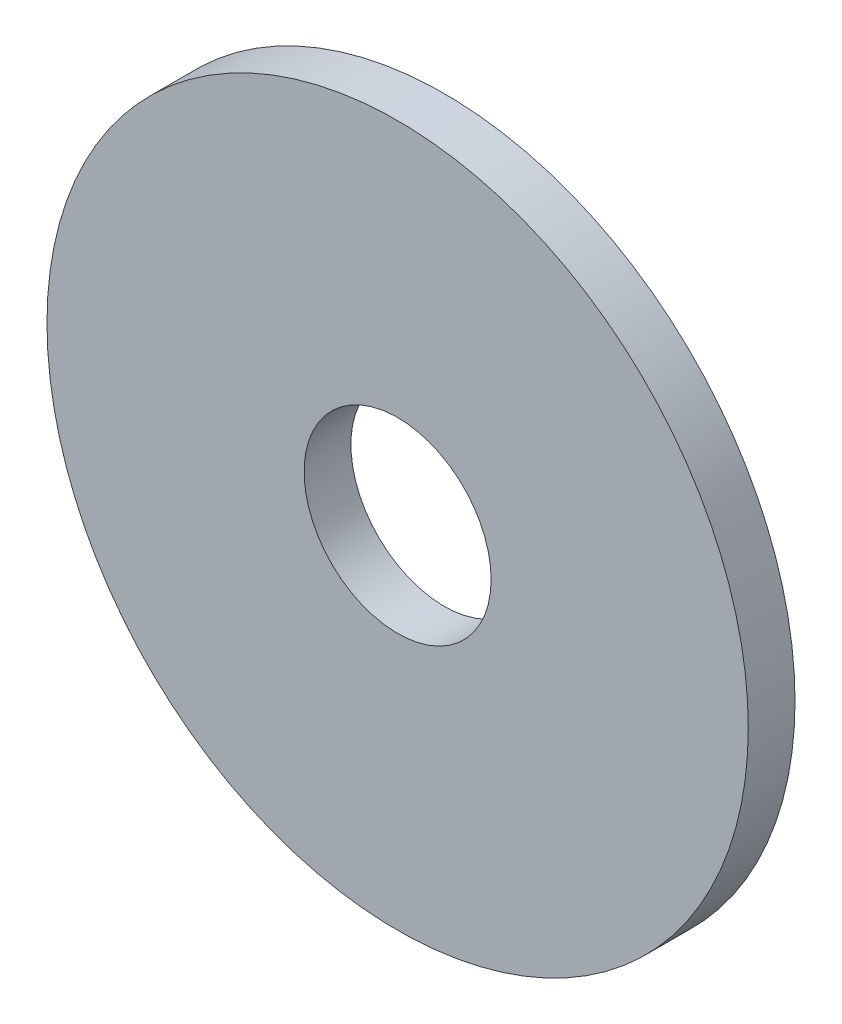
ISO-10303-21;
HEADER;
FILE_DESCRIPTION(('STEP AP214'),'2;1');
FILE_NAME('part.step','',(''),(''),'','','');
FILE_SCHEMA(('AUTOMOTIVE_DESIGN { 1 0 10303 214 1 1 1 1 }'));
ENDSEC;
DATA;
#1=APPLICATION_CONTEXT('core data for automotive mechanical design processes');
#2=APPLICATION_PROTOCOL_DEFINITION('international standard','automotive_design',2000,#1);
#3=PRODUCT_CONTEXT('',#1,'mechanical');
#4=PRODUCT('Part','Part','',(#3));
#5=PRODUCT_RELATED_PRODUCT_CATEGORY('part','',(#4));
#6=PRODUCT_DEFINITION_FORMATION('','',#4);
#7=PRODUCT_DEFINITION_CONTEXT('part definition',#1,'design');
#8=PRODUCT_DEFINITION('design','',#6,#7);
#9=PRODUCT_DEFINITION_SHAPE('','',#8);
#10=(LENGTH_UNIT() NAMED_UNIT(*) SI_UNIT(.MILLI.,.METRE.));
#11=(NAMED_UNIT(*) PLANE_ANGLE_UNIT() SI_UNIT($,.RADIAN.));
#12=(NAMED_UNIT(*) SI_UNIT($,.STERADIAN.) SOLID_ANGLE_UNIT());
#13=UNCERTAINTY_MEASURE_WITH_UNIT(LENGTH_MEASURE(1.E-05),#10,'distance_accuracy_value','');
#14=(GEOMETRIC_REPRESENTATION_CONTEXT(3) GLOBAL_UNCERTAINTY_ASSIGNED_CONTEXT((#13)) GLOBAL_UNIT_ASSIGNED_CONTEXT((#10,
#11,#12)) REPRESENTATION_CONTEXT('',''));
#15=CARTESIAN_POINT('',(0.,0.,0.));
#16=DIRECTION('',(0.,0.,1.));
#17=DIRECTION('',(1.,0.,0.));
#18=AXIS2_PLACEMENT_3D('',#15,#16,#17);
#19=CARTESIAN_POINT('',(0.,0.,1.));
#20=DIRECTION('',(0.,0.,1.));
#21=DIRECTION('',(1.,0.,0.));
#22=AXIS2_PLACEMENT_3D('',#19,#20,#21);
#23=PLANE('',#22);
#24=CARTESIAN_POINT('',(0.,0.,1.));
#25=DIRECTION('',(0.,0.,1.));
#26=DIRECTION('',(1.,0.,0.));
#27=AXIS2_PLACEMENT_3D('',#24,#25,#26);
#28=CIRCLE('',#27,7.5);
#29=CARTESIAN_POINT('',(7.5,0.,1.));
#30=VERTEX_POINT('',#29);
#31=EDGE_CURVE('E10',#30,#30,#28,.T.);
#32=ORIENTED_EDGE('',*,*,#31,.T.);
#33=EDGE_LOOP('',(#32));
#34=FACE_BOUND('',#33,.T.);
#35=CARTESIAN_POINT('',(0.,0.,1.));
#36=DIRECTION('',(0.,0.,1.));
#37=DIRECTION('',(1.,0.,0.));
#38=AXIS2_PLACEMENT_3D('',#35,#36,#37);
#39=CIRCLE('',#38,2.);
#40=CARTESIAN_POINT('',(2.,0.,1.));
#41=VERTEX_POINT('',#40);
#42=EDGE_CURVE('E43',#41,#41,#39,.T.);
#43=ORIENTED_EDGE('',*,*,#42,.F.);
#44=EDGE_LOOP('',(#43));
#45=FACE_BOUND('',#44,.T.);
#46=ADVANCED_FACE('F32',(#34,#45),#23,.T.);
#47=CARTESIAN_POINT('',(0.,0.,0.));
#48=DIRECTION('',(0.,0.,1.));
#49=DIRECTION('',(1.,0.,0.));
#50=AXIS2_PLACEMENT_3D('',#47,#48,#49);
#51=PLANE('',#50);
#52=CARTESIAN_POINT('',(0.,0.,0.));
#53=DIRECTION('',(0.,0.,1.));
#54=DIRECTION('',(1.,0.,0.));
#55=AXIS2_PLACEMENT_3D('',#52,#53,#54);
#56=CIRCLE('',#55,7.5);
#57=CARTESIAN_POINT('',(7.5,0.,0.));
#58=VERTEX_POINT('',#57);
#59=EDGE_CURVE('E36',#58,#58,#56,.T.);
#60=ORIENTED_EDGE('',*,*,#59,.F.);
#61=EDGE_LOOP('',(#60));
#62=FACE_BOUND('',#61,.T.);
#63=CARTESIAN_POINT('',(0.,0.,0.));
#64=DIRECTION('',(0.,0.,1.));
#65=DIRECTION('',(1.,0.,0.));
#66=AXIS2_PLACEMENT_3D('',#63,#64,#65);
#67=CIRCLE('',#66,2.);
#68=CARTESIAN_POINT('',(2.,0.,0.));
#69=VERTEX_POINT('',#68);
#70=EDGE_CURVE('E45',#69,#69,#67,.T.);
#71=ORIENTED_EDGE('',*,*,#70,.T.);
#72=EDGE_LOOP('',(#71));
#73=FACE_BOUND('',#72,.T.);
#74=ADVANCED_FACE('F55',(#62,#73),#51,.F.);
#75=CARTESIAN_POINT('',(0.,0.,1.));
#76=DIRECTION('',(0.,0.,-1.));
#77=DIRECTION('',(-1.,0.,0.));
#78=AXIS2_PLACEMENT_3D('',#75,#76,#77);
#79=CYLINDRICAL_SURFACE('',#78,7.5);
#80=ORIENTED_EDGE('',*,*,#31,.F.);
#81=EDGE_LOOP('',(#80));
#82=FACE_BOUND('',#81,.T.);
#83=ORIENTED_EDGE('',*,*,#59,.T.);
#84=EDGE_LOOP('',(#83));
#85=FACE_BOUND('',#84,.T.);
#86=ADVANCED_FACE('F34',(#82,#85),#79,.T.);
#87=CARTESIAN_POINT('',(0.,0.,1.));
#88=DIRECTION('',(0.,0.,-1.));
#89=DIRECTION('',(-1.,0.,0.));
#90=AXIS2_PLACEMENT_3D('',#87,#88,#89);
#91=CYLINDRICAL_SURFACE('',#90,2.);
#92=ORIENTED_EDGE('',*,*,#42,.T.);
#93=EDGE_LOOP('',(#92));
#94=FACE_BOUND('',#93,.T.);
#95=ORIENTED_EDGE('',*,*,#70,.F.);
#96=EDGE_LOOP('',(#95));
#97=FACE_BOUND('',#96,.T.);
#98=ADVANCED_FACE('F51',(#94,#97),#91,.F.);
#99=CLOSED_SHELL('',(#46,#74,#86,#98));
#100=MANIFOLD_SOLID_BREP('B2',#99);
#101=ADVANCED_BREP_SHAPE_REPRESENTATION('',(#18,#100),#14);
#102=SHAPE_DEFINITION_REPRESENTATION(#9,#101);
ENDSEC;
END-ISO-10303-21;
